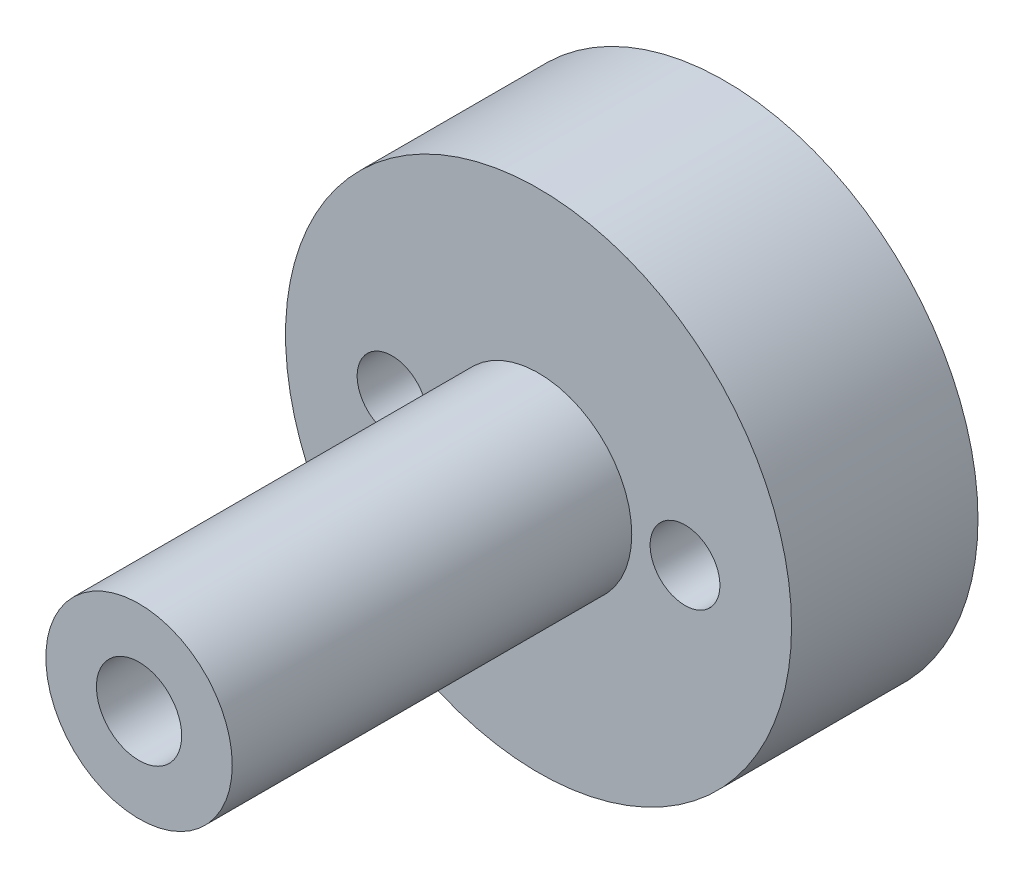
ISO-10303-21;
HEADER;
FILE_DESCRIPTION(('STEP AP214'),'2;1');
FILE_NAME('part.step','',(''),(''),'','','');
FILE_SCHEMA(('AUTOMOTIVE_DESIGN { 1 0 10303 214 1 1 1 1 }'));
ENDSEC;
DATA;
#1=APPLICATION_CONTEXT('core data for automotive mechanical design processes');
#2=APPLICATION_PROTOCOL_DEFINITION('international standard','automotive_design',2000,#1);
#3=PRODUCT_CONTEXT('',#1,'mechanical');
#4=PRODUCT('Part','Part','',(#3));
#5=PRODUCT_RELATED_PRODUCT_CATEGORY('part','',(#4));
#6=PRODUCT_DEFINITION_FORMATION('','',#4);
#7=PRODUCT_DEFINITION_CONTEXT('part definition',#1,'design');
#8=PRODUCT_DEFINITION('design','',#6,#7);
#9=PRODUCT_DEFINITION_SHAPE('','',#8);
#10=(LENGTH_UNIT() NAMED_UNIT(*) SI_UNIT(.MILLI.,.METRE.));
#11=(NAMED_UNIT(*) PLANE_ANGLE_UNIT() SI_UNIT($,.RADIAN.));
#12=(NAMED_UNIT(*) SI_UNIT($,.STERADIAN.) SOLID_ANGLE_UNIT());
#13=UNCERTAINTY_MEASURE_WITH_UNIT(LENGTH_MEASURE(1.E-05),#10,'distance_accuracy_value','');
#14=(GEOMETRIC_REPRESENTATION_CONTEXT(3) GLOBAL_UNCERTAINTY_ASSIGNED_CONTEXT((#13)) GLOBAL_UNIT_ASSIGNED_CONTEXT((#10,
#11,#12)) REPRESENTATION_CONTEXT('',''));
#15=CARTESIAN_POINT('',(0.,0.,0.));
#16=DIRECTION('',(0.,0.,1.));
#17=DIRECTION('',(1.,0.,0.));
#18=AXIS2_PLACEMENT_3D('',#15,#16,#17);
#19=CARTESIAN_POINT('',(0.,0.,7.));
#20=DIRECTION('',(0.,0.,1.));
#21=DIRECTION('',(1.,0.,0.));
#22=AXIS2_PLACEMENT_3D('',#19,#20,#21);
#23=PLANE('',#22);
#24=CARTESIAN_POINT('',(0.,0.,7.));
#25=DIRECTION('',(0.,0.,1.));
#26=DIRECTION('',(1.,0.,0.));
#27=AXIS2_PLACEMENT_3D('',#24,#25,#26);
#28=CIRCLE('',#27,1.31);
#29=CARTESIAN_POINT('',(1.31,0.,7.));
#30=VERTEX_POINT('',#29);
#31=EDGE_CURVE('E73',#30,#30,#28,.T.);
#32=ORIENTED_EDGE('',*,*,#31,.F.);
#33=EDGE_LOOP('',(#32));
#34=FACE_BOUND('',#33,.T.);
#35=CARTESIAN_POINT('',(0.,0.,7.));
#36=DIRECTION('',(0.,0.,1.));
#37=DIRECTION('',(1.,0.,0.));
#38=AXIS2_PLACEMENT_3D('',#35,#36,#37);
#39=CIRCLE('',#38,1.6);
#40=CARTESIAN_POINT('',(1.6,0.,7.));
#41=VERTEX_POINT('',#40);
#42=EDGE_CURVE('E10',#41,#41,#39,.F.);
#43=ORIENTED_EDGE('',*,*,#42,.F.);
#44=EDGE_LOOP('',(#43));
#45=FACE_BOUND('',#44,.T.);
#46=ADVANCED_FACE('F33',(#34,#45),#23,.T.);
#47=CARTESIAN_POINT('',(0.,0.,0.));
#48=DIRECTION('',(0.,0.,1.));
#49=DIRECTION('',(1.,0.,0.));
#50=AXIS2_PLACEMENT_3D('',#47,#48,#49);
#51=PLANE('',#50);
#52=CARTESIAN_POINT('',(0.,0.,0.));
#53=DIRECTION('',(0.,0.,1.));
#54=DIRECTION('',(1.,0.,0.));
#55=AXIS2_PLACEMENT_3D('',#52,#53,#54);
#56=CIRCLE('',#55,9.5);
#57=CARTESIAN_POINT('',(9.5,0.,0.));
#58=VERTEX_POINT('',#57);
#59=EDGE_CURVE('E41',#58,#58,#56,.T.);
#60=ORIENTED_EDGE('',*,*,#59,.F.);
#61=EDGE_LOOP('',(#60));
#62=FACE_BOUND('',#61,.T.);
#63=CARTESIAN_POINT('',(0.,0.,0.));
#64=DIRECTION('',(0.,0.,1.));
#65=DIRECTION('',(1.,0.,0.));
#66=AXIS2_PLACEMENT_3D('',#63,#64,#65);
#67=CIRCLE('',#66,7.6);
#68=CARTESIAN_POINT('',(7.6,0.,0.));
#69=VERTEX_POINT('',#68);
#70=EDGE_CURVE('E46',#69,#69,#67,.T.);
#71=ORIENTED_EDGE('',*,*,#70,.T.);
#72=EDGE_LOOP('',(#71));
#73=FACE_BOUND('',#72,.T.);
#74=ADVANCED_FACE('F86',(#62,#73),#51,.F.);
#75=CARTESIAN_POINT('',(0.,0.,5.));
#76=DIRECTION('',(0.,0.,-1.));
#77=DIRECTION('',(-1.,0.,0.));
#78=AXIS2_PLACEMENT_3D('',#75,#76,#77);
#79=CYLINDRICAL_SURFACE('',#78,9.5);
#80=ORIENTED_EDGE('',*,*,#59,.T.);
#81=EDGE_LOOP('',(#80));
#82=FACE_BOUND('',#81,.T.);
#83=CARTESIAN_POINT('',(0.,0.,7.));
#84=DIRECTION('',(0.,0.,1.));
#85=DIRECTION('',(1.,0.,0.));
#86=AXIS2_PLACEMENT_3D('',#83,#84,#85);
#87=CIRCLE('',#86,9.5);
#88=CARTESIAN_POINT('',(9.5,0.,7.));
#89=VERTEX_POINT('',#88);
#90=EDGE_CURVE('E76',#89,#89,#87,.T.);
#91=ORIENTED_EDGE('',*,*,#90,.F.);
#92=EDGE_LOOP('',(#91));
#93=FACE_BOUND('',#92,.T.);
#94=ADVANCED_FACE('F35',(#82,#93),#79,.T.);
#95=CARTESIAN_POINT('',(0.,0.,5.));
#96=DIRECTION('',(0.,0.,-1.));
#97=DIRECTION('',(-1.,0.,0.));
#98=AXIS2_PLACEMENT_3D('',#95,#96,#97);
#99=CYLINDRICAL_SURFACE('',#98,7.6);
#100=CARTESIAN_POINT('',(0.,0.,5.));
#101=DIRECTION('',(0.,0.,1.));
#102=DIRECTION('',(1.,0.,0.));
#103=AXIS2_PLACEMENT_3D('',#100,#101,#102);
#104=CIRCLE('',#103,7.6);
#105=CARTESIAN_POINT('',(7.6,0.,5.));
#106=VERTEX_POINT('',#105);
#107=EDGE_CURVE('E81',#106,#106,#104,.T.);
#108=ORIENTED_EDGE('',*,*,#107,.T.);
#109=EDGE_LOOP('',(#108));
#110=FACE_BOUND('',#109,.T.);
#111=ORIENTED_EDGE('',*,*,#70,.F.);
#112=EDGE_LOOP('',(#111));
#113=FACE_BOUND('',#112,.T.);
#114=ADVANCED_FACE('F88',(#110,#113),#99,.F.);
#115=CARTESIAN_POINT('',(0.,0.,5.));
#116=DIRECTION('',(0.,0.,1.));
#117=DIRECTION('',(1.,0.,0.));
#118=AXIS2_PLACEMENT_3D('',#115,#116,#117);
#119=PLANE('',#118);
#120=CARTESIAN_POINT('',(-5.5,0.,5.));
#121=DIRECTION('',(0.,0.,1.));
#122=DIRECTION('',(1.,0.,0.));
#123=AXIS2_PLACEMENT_3D('',#120,#121,#122);
#124=CIRCLE('',#123,1.31);
#125=CARTESIAN_POINT('',(-4.19,0.,5.));
#126=VERTEX_POINT('',#125);
#127=EDGE_CURVE('E59',#126,#126,#124,.T.);
#128=ORIENTED_EDGE('',*,*,#127,.T.);
#129=EDGE_LOOP('',(#128));
#130=FACE_BOUND('',#129,.T.);
#131=CARTESIAN_POINT('',(5.5,0.,5.));
#132=DIRECTION('',(0.,0.,1.));
#133=DIRECTION('',(1.,0.,0.));
#134=AXIS2_PLACEMENT_3D('',#131,#132,#133);
#135=CIRCLE('',#134,1.31);
#136=CARTESIAN_POINT('',(6.81,0.,5.));
#137=VERTEX_POINT('',#136);
#138=EDGE_CURVE('E51',#137,#137,#135,.T.);
#139=ORIENTED_EDGE('',*,*,#138,.T.);
#140=EDGE_LOOP('',(#139));
#141=FACE_BOUND('',#140,.T.);
#142=CARTESIAN_POINT('',(0.,0.,5.));
#143=DIRECTION('',(0.,0.,1.));
#144=DIRECTION('',(1.,0.,0.));
#145=AXIS2_PLACEMENT_3D('',#142,#143,#144);
#146=CIRCLE('',#145,1.31);
#147=CARTESIAN_POINT('',(1.31,0.,5.));
#148=VERTEX_POINT('',#147);
#149=EDGE_CURVE('E70',#148,#148,#146,.T.);
#150=ORIENTED_EDGE('',*,*,#149,.T.);
#151=EDGE_LOOP('',(#150));
#152=FACE_BOUND('',#151,.T.);
#153=ORIENTED_EDGE('',*,*,#107,.F.);
#154=EDGE_LOOP('',(#153));
#155=FACE_BOUND('',#154,.T.);
#156=ADVANCED_FACE('F90',(#130,#141,#152,#155),#119,.F.);
#157=CARTESIAN_POINT('',(-5.5,0.,7.));
#158=DIRECTION('',(0.,0.,1.));
#159=DIRECTION('',(1.,0.,0.));
#160=AXIS2_PLACEMENT_3D('',#157,#158,#159);
#161=CIRCLE('',#160,1.31);
#162=CARTESIAN_POINT('',(-4.19,0.,7.));
#163=VERTEX_POINT('',#162);
#164=EDGE_CURVE('E37',#163,#163,#161,.T.);
#165=ORIENTED_EDGE('',*,*,#164,.F.);
#166=EDGE_LOOP('',(#165));
#167=FACE_BOUND('',#166,.T.);
#168=CARTESIAN_POINT('',(5.5,0.,7.));
#169=DIRECTION('',(0.,0.,1.));
#170=DIRECTION('',(1.,0.,0.));
#171=AXIS2_PLACEMENT_3D('',#168,#169,#170);
#172=CIRCLE('',#171,1.31);
#173=CARTESIAN_POINT('',(6.81,0.,7.));
#174=VERTEX_POINT('',#173);
#175=EDGE_CURVE('E49',#174,#174,#172,.T.);
#176=ORIENTED_EDGE('',*,*,#175,.F.);
#177=EDGE_LOOP('',(#176));
#178=FACE_BOUND('',#177,.T.);
#179=CARTESIAN_POINT('',(0.,0.,7.));
#180=DIRECTION('',(0.,0.,1.));
#181=DIRECTION('',(1.,0.,0.));
#182=AXIS2_PLACEMENT_3D('',#179,#180,#181);
#183=CIRCLE('',#182,3.5);
#184=CARTESIAN_POINT('',(3.5,0.,7.));
#185=VERTEX_POINT('',#184);
#186=EDGE_CURVE('E63',#185,#185,#183,.T.);
#187=ORIENTED_EDGE('',*,*,#186,.F.);
#188=EDGE_LOOP('',(#187));
#189=FACE_BOUND('',#188,.T.);
#190=ORIENTED_EDGE('',*,*,#90,.T.);
#191=EDGE_LOOP('',(#190));
#192=FACE_BOUND('',#191,.T.);
#193=ADVANCED_FACE('F97',(#167,#178,#189,#192),#23,.T.);
#194=CARTESIAN_POINT('',(0.,0.,7.));
#195=DIRECTION('',(0.,0.,-1.));
#196=DIRECTION('',(-1.,0.,0.));
#197=AXIS2_PLACEMENT_3D('',#194,#195,#196);
#198=CYLINDRICAL_SURFACE('',#197,1.31);
#199=ORIENTED_EDGE('',*,*,#31,.T.);
#200=EDGE_LOOP('',(#199));
#201=FACE_BOUND('',#200,.T.);
#202=ORIENTED_EDGE('',*,*,#149,.F.);
#203=EDGE_LOOP('',(#202));
#204=FACE_BOUND('',#203,.T.);
#205=ADVANCED_FACE('F112',(#201,#204),#198,.F.);
#206=CARTESIAN_POINT('',(0.,0.,22.));
#207=DIRECTION('',(0.,0.,-1.));
#208=DIRECTION('',(-1.,0.,0.));
#209=AXIS2_PLACEMENT_3D('',#206,#207,#208);
#210=CYLINDRICAL_SURFACE('',#209,1.6);
#211=CARTESIAN_POINT('',(0.,0.,22.));
#212=DIRECTION('',(0.,0.,1.));
#213=DIRECTION('',(1.,0.,0.));
#214=AXIS2_PLACEMENT_3D('',#211,#212,#213);
#215=CIRCLE('',#214,1.6);
#216=CARTESIAN_POINT('',(1.6,0.,22.));
#217=VERTEX_POINT('',#216);
#218=EDGE_CURVE('E64',#217,#217,#215,.T.);
#219=ORIENTED_EDGE('',*,*,#218,.T.);
#220=EDGE_LOOP('',(#219));
#221=FACE_BOUND('',#220,.T.);
#222=ORIENTED_EDGE('',*,*,#42,.T.);
#223=EDGE_LOOP('',(#222));
#224=FACE_BOUND('',#223,.T.);
#225=ADVANCED_FACE('F117',(#221,#224),#210,.F.);
#226=CARTESIAN_POINT('',(0.,0.,22.));
#227=DIRECTION('',(0.,0.,-1.));
#228=DIRECTION('',(-1.,0.,0.));
#229=AXIS2_PLACEMENT_3D('',#226,#227,#228);
#230=CYLINDRICAL_SURFACE('',#229,3.5);
#231=CARTESIAN_POINT('',(0.,0.,22.));
#232=DIRECTION('',(0.,0.,1.));
#233=DIRECTION('',(1.,0.,0.));
#234=AXIS2_PLACEMENT_3D('',#231,#232,#233);
#235=CIRCLE('',#234,3.5);
#236=CARTESIAN_POINT('',(3.5,0.,22.));
#237=VERTEX_POINT('',#236);
#238=EDGE_CURVE('E67',#237,#237,#235,.T.);
#239=ORIENTED_EDGE('',*,*,#238,.F.);
#240=EDGE_LOOP('',(#239));
#241=FACE_BOUND('',#240,.T.);
#242=ORIENTED_EDGE('',*,*,#186,.T.);
#243=EDGE_LOOP('',(#242));
#244=FACE_BOUND('',#243,.T.);
#245=ADVANCED_FACE('F127',(#241,#244),#230,.T.);
#246=CARTESIAN_POINT('',(0.,0.,22.));
#247=DIRECTION('',(0.,0.,1.));
#248=DIRECTION('',(1.,0.,0.));
#249=AXIS2_PLACEMENT_3D('',#246,#247,#248);
#250=PLANE('',#249);
#251=ORIENTED_EDGE('',*,*,#218,.F.);
#252=EDGE_LOOP('',(#251));
#253=FACE_BOUND('',#252,.T.);
#254=ORIENTED_EDGE('',*,*,#238,.T.);
#255=EDGE_LOOP('',(#254));
#256=FACE_BOUND('',#255,.T.);
#257=ADVANCED_FACE('F129',(#253,#256),#250,.T.);
#258=CARTESIAN_POINT('',(5.5,0.,0.));
#259=DIRECTION('',(0.,0.,1.));
#260=DIRECTION('',(1.,0.,0.));
#261=AXIS2_PLACEMENT_3D('',#258,#259,#260);
#262=CYLINDRICAL_SURFACE('',#261,1.31);
#263=ORIENTED_EDGE('',*,*,#175,.T.);
#264=EDGE_LOOP('',(#263));
#265=FACE_BOUND('',#264,.T.);
#266=ORIENTED_EDGE('',*,*,#138,.F.);
#267=EDGE_LOOP('',(#266));
#268=FACE_BOUND('',#267,.T.);
#269=ADVANCED_FACE('F136',(#265,#268),#262,.F.);
#270=CARTESIAN_POINT('',(-5.5,0.,0.));
#271=DIRECTION('',(0.,0.,1.));
#272=DIRECTION('',(1.,0.,0.));
#273=AXIS2_PLACEMENT_3D('',#270,#271,#272);
#274=CYLINDRICAL_SURFACE('',#273,1.31);
#275=ORIENTED_EDGE('',*,*,#164,.T.);
#276=EDGE_LOOP('',(#275));
#277=FACE_BOUND('',#276,.T.);
#278=ORIENTED_EDGE('',*,*,#127,.F.);
#279=EDGE_LOOP('',(#278));
#280=FACE_BOUND('',#279,.T.);
#281=ADVANCED_FACE('F145',(#277,#280),#274,.F.);
#282=CLOSED_SHELL('',(#46,#74,#94,#114,#156,#193,#205,#225,#245,#257,#269,#281));
#283=MANIFOLD_SOLID_BREP('B2',#282);
#284=ADVANCED_BREP_SHAPE_REPRESENTATION('',(#18,#283),#14);
#285=SHAPE_DEFINITION_REPRESENTATION(#9,#284);
ENDSEC;
END-ISO-10303-21;
